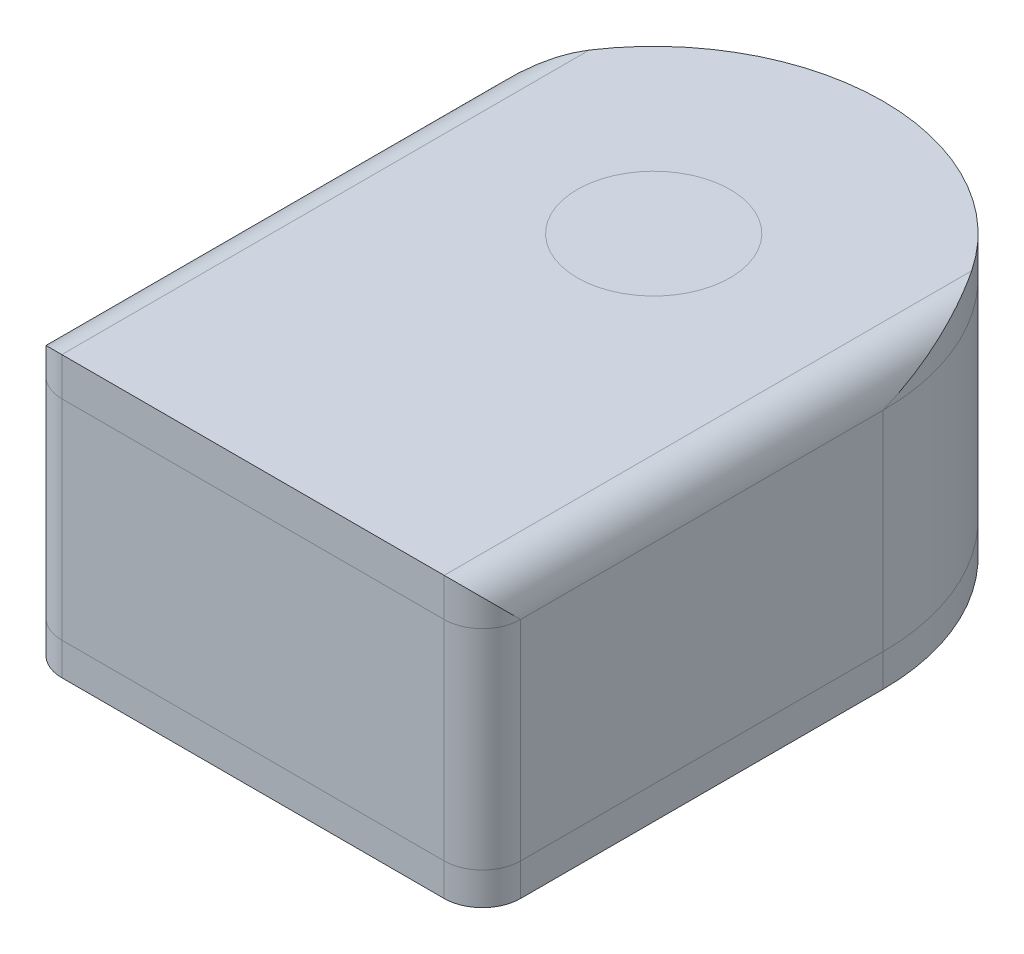
ISO-10303-21;
HEADER;
FILE_DESCRIPTION(('STEP AP214'),'2;1');
FILE_NAME('part.step','',(''),(''),'','','');
FILE_SCHEMA(('AUTOMOTIVE_DESIGN { 1 0 10303 214 1 1 1 1 }'));
ENDSEC;
DATA;
#1=APPLICATION_CONTEXT('core data for automotive mechanical design processes');
#2=APPLICATION_PROTOCOL_DEFINITION('international standard','automotive_design',2000,#1);
#3=PRODUCT_CONTEXT('',#1,'mechanical');
#4=PRODUCT('Part','Part','',(#3));
#5=PRODUCT_RELATED_PRODUCT_CATEGORY('part','',(#4));
#6=PRODUCT_DEFINITION_FORMATION('','',#4);
#7=PRODUCT_DEFINITION_CONTEXT('part definition',#1,'design');
#8=PRODUCT_DEFINITION('design','',#6,#7);
#9=PRODUCT_DEFINITION_SHAPE('','',#8);
#10=(LENGTH_UNIT() NAMED_UNIT(*) SI_UNIT(.MILLI.,.METRE.));
#11=(NAMED_UNIT(*) PLANE_ANGLE_UNIT() SI_UNIT($,.RADIAN.));
#12=(NAMED_UNIT(*) SI_UNIT($,.STERADIAN.) SOLID_ANGLE_UNIT());
#13=UNCERTAINTY_MEASURE_WITH_UNIT(LENGTH_MEASURE(1.E-05),#10,'distance_accuracy_value','');
#14=(GEOMETRIC_REPRESENTATION_CONTEXT(3) GLOBAL_UNCERTAINTY_ASSIGNED_CONTEXT((#13)) GLOBAL_UNIT_ASSIGNED_CONTEXT((#10,
#11,#12)) REPRESENTATION_CONTEXT('',''));
#15=CARTESIAN_POINT('',(0.,0.,0.));
#16=DIRECTION('',(0.,0.,1.));
#17=DIRECTION('',(1.,0.,0.));
#18=AXIS2_PLACEMENT_3D('',#15,#16,#17);
#19=CARTESIAN_POINT('',(-12.5,9.15,13.1));
#20=DIRECTION('',(0.,0.,-1.));
#21=DIRECTION('',(-1.,0.,0.));
#22=AXIS2_PLACEMENT_3D('',#19,#20,#21);
#23=PLANE('',#22);
#24=DIRECTION('',(0.,-1.,0.));
#25=VECTOR('',#24,1.);
#26=CARTESIAN_POINT('',(12.5,9.15,13.1));
#27=LINE('',#26,#25);
#28=CARTESIAN_POINT('',(12.5,6.65,13.1));
#29=VERTEX_POINT('',#28);
#30=CARTESIAN_POINT('',(12.5,-7.02,13.1));
#31=VERTEX_POINT('',#30);
#32=EDGE_CURVE('E187',#29,#31,#27,.T.);
#33=ORIENTED_EDGE('',*,*,#32,.F.);
#34=DIRECTION('',(-1.,0.,0.));
#35=VECTOR('',#34,1.);
#36=CARTESIAN_POINT('',(-12.5,6.65,13.1));
#37=LINE('',#36,#35);
#38=CARTESIAN_POINT('',(-12.5,6.65,13.1));
#39=VERTEX_POINT('',#38);
#40=EDGE_CURVE('E12',#29,#39,#37,.T.);
#41=ORIENTED_EDGE('',*,*,#40,.T.);
#42=DIRECTION('',(0.,-1.,0.));
#43=VECTOR('',#42,1.);
#44=CARTESIAN_POINT('',(-12.5,9.15,13.1));
#45=LINE('',#44,#43);
#46=CARTESIAN_POINT('',(-12.5,-7.02,13.1));
#47=VERTEX_POINT('',#46);
#48=EDGE_CURVE('E148',#39,#47,#45,.T.);
#49=ORIENTED_EDGE('',*,*,#48,.T.);
#50=DIRECTION('',(-1.,0.,0.));
#51=VECTOR('',#50,1.);
#52=CARTESIAN_POINT('',(-12.5,-7.02,13.1));
#53=LINE('',#52,#51);
#54=EDGE_CURVE('E278',#31,#47,#53,.T.);
#55=ORIENTED_EDGE('',*,*,#54,.F.);
#56=EDGE_LOOP('',(#33,#41,#49,#55));
#57=FACE_BOUND('',#56,.T.);
#58=ADVANCED_FACE('F38',(#57),#23,.F.);
#59=CARTESIAN_POINT('',(-12.5,9.15,10.6));
#60=DIRECTION('',(0.,-1.,0.));
#61=DIRECTION('',(0.,0.,-1.));
#62=AXIS2_PLACEMENT_3D('',#59,#60,#61);
#63=CYLINDRICAL_SURFACE('',#62,2.5);
#64=ORIENTED_EDGE('',*,*,#48,.F.);
#65=CARTESIAN_POINT('',(-12.5,6.65,10.6));
#66=DIRECTION('',(0.,-1.,0.));
#67=DIRECTION('',(0.,0.,-1.));
#68=AXIS2_PLACEMENT_3D('',#65,#66,#67);
#69=CIRCLE('',#68,2.5);
#70=CARTESIAN_POINT('',(-15.,6.65,10.6));
#71=VERTEX_POINT('',#70);
#72=EDGE_CURVE('E47',#39,#71,#69,.T.);
#73=ORIENTED_EDGE('',*,*,#72,.T.);
#74=DIRECTION('',(0.,-1.,0.));
#75=VECTOR('',#74,1.);
#76=CARTESIAN_POINT('',(-15.,9.15,10.6));
#77=LINE('',#76,#75);
#78=CARTESIAN_POINT('',(-15.,-7.02,10.6));
#79=VERTEX_POINT('',#78);
#80=EDGE_CURVE('E189',#71,#79,#77,.T.);
#81=ORIENTED_EDGE('',*,*,#80,.T.);
#82=CARTESIAN_POINT('',(-12.5,-7.02,10.6));
#83=DIRECTION('',(0.,-1.,0.));
#84=DIRECTION('',(0.,0.,-1.));
#85=AXIS2_PLACEMENT_3D('',#82,#83,#84);
#86=CIRCLE('',#85,2.5);
#87=EDGE_CURVE('E272',#47,#79,#86,.T.);
#88=ORIENTED_EDGE('',*,*,#87,.F.);
#89=EDGE_LOOP('',(#64,#73,#81,#88));
#90=FACE_BOUND('',#89,.T.);
#91=ADVANCED_FACE('F234',(#90),#63,.T.);
#92=CARTESIAN_POINT('',(12.5,9.15,10.6));
#93=DIRECTION('',(0.,-1.,0.));
#94=DIRECTION('',(0.,0.,-1.));
#95=AXIS2_PLACEMENT_3D('',#92,#93,#94);
#96=CYLINDRICAL_SURFACE('',#95,2.5);
#97=DIRECTION('',(0.,-1.,0.));
#98=VECTOR('',#97,1.);
#99=CARTESIAN_POINT('',(15.,9.15,10.6));
#100=LINE('',#99,#98);
#101=CARTESIAN_POINT('',(15.,6.65,10.6));
#102=VERTEX_POINT('',#101);
#103=CARTESIAN_POINT('',(15.,-7.02,10.6));
#104=VERTEX_POINT('',#103);
#105=EDGE_CURVE('E183',#102,#104,#100,.T.);
#106=ORIENTED_EDGE('',*,*,#105,.F.);
#107=CARTESIAN_POINT('',(12.5,6.65,10.6));
#108=DIRECTION('',(0.,-1.,0.));
#109=DIRECTION('',(0.,0.,-1.));
#110=AXIS2_PLACEMENT_3D('',#107,#108,#109);
#111=CIRCLE('',#110,2.5);
#112=EDGE_CURVE('E302',#102,#29,#111,.T.);
#113=ORIENTED_EDGE('',*,*,#112,.T.);
#114=ORIENTED_EDGE('',*,*,#32,.T.);
#115=CARTESIAN_POINT('',(12.5,-7.02,10.6));
#116=DIRECTION('',(0.,-1.,0.));
#117=DIRECTION('',(0.,0.,-1.));
#118=AXIS2_PLACEMENT_3D('',#115,#116,#117);
#119=CIRCLE('',#118,2.5);
#120=EDGE_CURVE('E282',#104,#31,#119,.T.);
#121=ORIENTED_EDGE('',*,*,#120,.F.);
#122=EDGE_LOOP('',(#106,#113,#114,#121));
#123=FACE_BOUND('',#122,.T.);
#124=ADVANCED_FACE('F241',(#123),#96,.T.);
#125=CARTESIAN_POINT('',(0.,9.15,-13.1));
#126=DIRECTION('',(0.,-1.,0.));
#127=DIRECTION('',(0.,0.,-1.));
#128=AXIS2_PLACEMENT_3D('',#125,#126,#127);
#129=CYLINDRICAL_SURFACE('',#128,15.);
#130=DIRECTION('',(0.,-1.,0.));
#131=VECTOR('',#130,1.);
#132=CARTESIAN_POINT('',(-15.,9.15,-13.1));
#133=LINE('',#132,#131);
#134=CARTESIAN_POINT('',(-15.,6.65,-13.1));
#135=VERTEX_POINT('',#134);
#136=CARTESIAN_POINT('',(-15.,-7.02,-13.1));
#137=VERTEX_POINT('',#136);
#138=EDGE_CURVE('E193',#135,#137,#133,.T.);
#139=ORIENTED_EDGE('',*,*,#138,.F.);
#140=CARTESIAN_POINT('',(0.,6.65,-13.1));
#141=DIRECTION('',(0.,-1.,0.));
#142=DIRECTION('',(0.,0.,-1.));
#143=AXIS2_PLACEMENT_3D('',#140,#141,#142);
#144=CIRCLE('',#143,15.);
#145=CARTESIAN_POINT('',(15.,6.65,-13.1));
#146=VERTEX_POINT('',#145);
#147=EDGE_CURVE('E300',#135,#146,#144,.T.);
#148=ORIENTED_EDGE('',*,*,#147,.T.);
#149=DIRECTION('',(0.,-1.,0.));
#150=VECTOR('',#149,1.);
#151=CARTESIAN_POINT('',(15.,9.15,-13.1));
#152=LINE('',#151,#150);
#153=CARTESIAN_POINT('',(15.,-7.02,-13.1));
#154=VERTEX_POINT('',#153);
#155=EDGE_CURVE('E157',#146,#154,#152,.T.);
#156=ORIENTED_EDGE('',*,*,#155,.T.);
#157=CARTESIAN_POINT('',(0.,-7.02,-13.1));
#158=DIRECTION('',(0.,-1.,0.));
#159=DIRECTION('',(0.,0.,-1.));
#160=AXIS2_PLACEMENT_3D('',#157,#158,#159);
#161=CIRCLE('',#160,15.);
#162=EDGE_CURVE('E289',#137,#154,#161,.T.);
#163=ORIENTED_EDGE('',*,*,#162,.F.);
#164=EDGE_LOOP('',(#139,#148,#156,#163));
#165=FACE_BOUND('',#164,.T.);
#166=ADVANCED_FACE('F217',(#165),#129,.T.);
#167=CARTESIAN_POINT('',(0.,-9.15,-13.1));
#168=DIRECTION('',(0.,1.,0.));
#169=DIRECTION('',(0.,0.,1.));
#170=AXIS2_PLACEMENT_3D('',#167,#168,#169);
#171=PLANE('',#170);
#172=CARTESIAN_POINT('',(9.525,-9.15,-13.1000000000001));
#173=DIRECTION('',(0.,-1.,0.));
#174=DIRECTION('',(0.,0.,-1.));
#175=AXIS2_PLACEMENT_3D('',#172,#173,#174);
#176=CIRCLE('',#175,1.25);
#177=CARTESIAN_POINT('',(9.525,-9.15,-14.3500000000001));
#178=VERTEX_POINT('',#177);
#179=EDGE_CURVE('E409',#178,#178,#176,.T.);
#180=ORIENTED_EDGE('',*,*,#179,.F.);
#181=EDGE_LOOP('',(#180));
#182=FACE_BOUND('',#181,.T.);
#183=CARTESIAN_POINT('',(-9.52500000000001,-9.15,-13.1));
#184=DIRECTION('',(0.,-1.,0.));
#185=DIRECTION('',(0.,0.,-1.));
#186=AXIS2_PLACEMENT_3D('',#183,#184,#185);
#187=CIRCLE('',#186,1.25);
#188=CARTESIAN_POINT('',(-9.52500000000001,-9.15,-14.35));
#189=VERTEX_POINT('',#188);
#190=EDGE_CURVE('E413',#189,#189,#187,.T.);
#191=ORIENTED_EDGE('',*,*,#190,.F.);
#192=EDGE_LOOP('',(#191));
#193=FACE_BOUND('',#192,.T.);
#194=CARTESIAN_POINT('',(9.04996546954743,-9.15,-7.8750000000001));
#195=DIRECTION('',(0.,-1.,0.));
#196=DIRECTION('',(0.,0.,-1.));
#197=AXIS2_PLACEMENT_3D('',#194,#195,#196);
#198=CIRCLE('',#197,0.799999999999999);
#199=CARTESIAN_POINT('',(9.04996546954743,-9.15,-8.6750000000001));
#200=VERTEX_POINT('',#199);
#201=EDGE_CURVE('E419',#200,#200,#198,.T.);
#202=ORIENTED_EDGE('',*,*,#201,.F.);
#203=EDGE_LOOP('',(#202));
#204=FACE_BOUND('',#203,.T.);
#205=CARTESIAN_POINT('',(-9.04996546954737,-9.15,-7.87499999999997));
#206=DIRECTION('',(0.,-1.,0.));
#207=DIRECTION('',(0.,0.,-1.));
#208=AXIS2_PLACEMENT_3D('',#205,#206,#207);
#209=CIRCLE('',#208,0.800000000000002);
#210=CARTESIAN_POINT('',(-9.04996546954737,-9.15,-8.67499999999997));
#211=VERTEX_POINT('',#210);
#212=EDGE_CURVE('E425',#211,#211,#209,.T.);
#213=ORIENTED_EDGE('',*,*,#212,.F.);
#214=EDGE_LOOP('',(#213));
#215=FACE_BOUND('',#214,.T.);
#216=CARTESIAN_POINT('',(0.,-9.15,-23.55));
#217=DIRECTION('',(0.,-1.,0.));
#218=DIRECTION('',(0.,0.,-1.));
#219=AXIS2_PLACEMENT_3D('',#216,#217,#218);
#220=CIRCLE('',#219,0.8);
#221=CARTESIAN_POINT('',(0.,-9.15,-24.35));
#222=VERTEX_POINT('',#221);
#223=EDGE_CURVE('E431',#222,#222,#220,.T.);
#224=ORIENTED_EDGE('',*,*,#223,.F.);
#225=EDGE_LOOP('',(#224));
#226=FACE_BOUND('',#225,.T.);
#227=CARTESIAN_POINT('',(0.,-9.15,-13.1));
#228=DIRECTION('',(0.,1.,0.));
#229=DIRECTION('',(0.,0.,1.));
#230=AXIS2_PLACEMENT_3D('',#227,#228,#229);
#231=CIRCLE('',#230,15.);
#232=CARTESIAN_POINT('',(15.,-9.15,-13.1));
#233=VERTEX_POINT('',#232);
#234=CARTESIAN_POINT('',(-15.,-9.15,-13.1));
#235=VERTEX_POINT('',#234);
#236=EDGE_CURVE('E163',#233,#235,#231,.T.);
#237=ORIENTED_EDGE('',*,*,#236,.F.);
#238=DIRECTION('',(0.,0.,-1.));
#239=VECTOR('',#238,1.);
#240=CARTESIAN_POINT('',(15.,-9.15,-13.1));
#241=LINE('',#240,#239);
#242=CARTESIAN_POINT('',(15.,-9.15,10.6));
#243=VERTEX_POINT('',#242);
#244=EDGE_CURVE('E159',#243,#233,#241,.T.);
#245=ORIENTED_EDGE('',*,*,#244,.F.);
#246=CARTESIAN_POINT('',(12.5,-9.15,10.6));
#247=DIRECTION('',(0.,1.,0.));
#248=DIRECTION('',(0.,0.,1.));
#249=AXIS2_PLACEMENT_3D('',#246,#247,#248);
#250=CIRCLE('',#249,2.5);
#251=CARTESIAN_POINT('',(12.5,-9.15,13.1));
#252=VERTEX_POINT('',#251);
#253=EDGE_CURVE('E176',#252,#243,#250,.T.);
#254=ORIENTED_EDGE('',*,*,#253,.F.);
#255=DIRECTION('',(1.,0.,0.));
#256=VECTOR('',#255,1.);
#257=CARTESIAN_POINT('',(-12.5,-9.15,13.1));
#258=LINE('',#257,#256);
#259=CARTESIAN_POINT('',(-12.5,-9.15,13.1));
#260=VERTEX_POINT('',#259);
#261=EDGE_CURVE('E173',#260,#252,#258,.T.);
#262=ORIENTED_EDGE('',*,*,#261,.F.);
#263=CARTESIAN_POINT('',(-12.5,-9.15,10.6));
#264=DIRECTION('',(0.,1.,0.));
#265=DIRECTION('',(0.,0.,1.));
#266=AXIS2_PLACEMENT_3D('',#263,#264,#265);
#267=CIRCLE('',#266,2.5);
#268=CARTESIAN_POINT('',(-15.,-9.15,10.6));
#269=VERTEX_POINT('',#268);
#270=EDGE_CURVE('E170',#269,#260,#267,.T.);
#271=ORIENTED_EDGE('',*,*,#270,.F.);
#272=DIRECTION('',(0.,0.,1.));
#273=VECTOR('',#272,1.);
#274=CARTESIAN_POINT('',(-15.,-9.15,-13.1));
#275=LINE('',#274,#273);
#276=EDGE_CURVE('E166',#235,#269,#275,.T.);
#277=ORIENTED_EDGE('',*,*,#276,.F.);
#278=EDGE_LOOP('',(#237,#245,#254,#262,#271,#277));
#279=FACE_BOUND('',#278,.T.);
#280=CARTESIAN_POINT('',(0.,-9.15,-13.1));
#281=DIRECTION('',(0.,-1.,0.));
#282=DIRECTION('',(0.,0.,-1.));
#283=AXIS2_PLACEMENT_3D('',#280,#281,#282);
#284=CIRCLE('',#283,5.);
#285=CARTESIAN_POINT('',(0.,-9.15,-18.1));
#286=VERTEX_POINT('',#285);
#287=EDGE_CURVE('E403',#286,#286,#284,.T.);
#288=ORIENTED_EDGE('',*,*,#287,.F.);
#289=EDGE_LOOP('',(#288));
#290=FACE_BOUND('',#289,.T.);
#291=ADVANCED_FACE('F324',(#182,#193,#204,#215,#226,#279,#290),#171,.F.);
#292=CARTESIAN_POINT('',(0.,9.15,-13.1));
#293=DIRECTION('',(0.,1.,0.));
#294=DIRECTION('',(0.,0.,1.));
#295=AXIS2_PLACEMENT_3D('',#292,#293,#294);
#296=PLANE('',#295);
#297=CARTESIAN_POINT('',(0.,9.15,-13.1));
#298=DIRECTION('',(0.,1.,0.));
#299=DIRECTION('',(0.,0.,1.));
#300=AXIS2_PLACEMENT_3D('',#297,#298,#299);
#301=CIRCLE('',#300,15.);
#302=CARTESIAN_POINT('',(12.5,9.15,-21.3915619758885));
#303=VERTEX_POINT('',#302);
#304=CARTESIAN_POINT('',(-12.5,9.15,-21.3915619758885));
#305=VERTEX_POINT('',#304);
#306=EDGE_CURVE('E141',#303,#305,#301,.T.);
#307=ORIENTED_EDGE('',*,*,#306,.T.);
#308=DIRECTION('',(0.,0.,1.));
#309=VECTOR('',#308,1.);
#310=CARTESIAN_POINT('',(-12.5,9.15,10.6));
#311=LINE('',#310,#309);
#312=CARTESIAN_POINT('',(-12.5,9.15,13.1));
#313=VERTEX_POINT('',#312);
#314=EDGE_CURVE('E125',#305,#313,#311,.T.);
#315=ORIENTED_EDGE('',*,*,#314,.T.);
#316=DIRECTION('',(1.,0.,0.));
#317=VECTOR('',#316,1.);
#318=CARTESIAN_POINT('',(-12.5,9.15,13.1));
#319=LINE('',#318,#317);
#320=CARTESIAN_POINT('',(12.5,9.15,13.1));
#321=VERTEX_POINT('',#320);
#322=EDGE_CURVE('E139',#313,#321,#319,.T.);
#323=ORIENTED_EDGE('',*,*,#322,.T.);
#324=DIRECTION('',(0.,0.,-1.));
#325=VECTOR('',#324,1.);
#326=CARTESIAN_POINT('',(12.5,9.15,-13.1));
#327=LINE('',#326,#325);
#328=EDGE_CURVE('E142',#321,#303,#327,.T.);
#329=ORIENTED_EDGE('',*,*,#328,.T.);
#330=EDGE_LOOP('',(#307,#315,#323,#329));
#331=FACE_BOUND('',#330,.T.);
#332=CARTESIAN_POINT('',(0.,9.15,-13.1));
#333=DIRECTION('',(0.,1.,0.));
#334=DIRECTION('',(0.,0.,1.));
#335=AXIS2_PLACEMENT_3D('',#332,#333,#334);
#336=CIRCLE('',#335,5.);
#337=CARTESIAN_POINT('',(0.,9.15,-8.10000000000001));
#338=VERTEX_POINT('',#337);
#339=EDGE_CURVE('E281',#338,#338,#336,.F.);
#340=ORIENTED_EDGE('',*,*,#339,.T.);
#341=EDGE_LOOP('',(#340));
#342=FACE_BOUND('',#341,.T.);
#343=ADVANCED_FACE('F135',(#331,#342),#296,.T.);
#344=EDGE_CURVE('E186',#31,#252,#27,.T.);
#345=ORIENTED_EDGE('',*,*,#344,.F.);
#346=ORIENTED_EDGE('',*,*,#54,.T.);
#347=EDGE_CURVE('E150',#47,#260,#45,.T.);
#348=ORIENTED_EDGE('',*,*,#347,.T.);
#349=ORIENTED_EDGE('',*,*,#261,.T.);
#350=EDGE_LOOP('',(#345,#346,#348,#349));
#351=FACE_BOUND('',#350,.T.);
#352=ADVANCED_FACE('F236',(#351),#23,.F.);
#353=EDGE_CURVE('E182',#104,#243,#100,.T.);
#354=ORIENTED_EDGE('',*,*,#353,.F.);
#355=ORIENTED_EDGE('',*,*,#120,.T.);
#356=ORIENTED_EDGE('',*,*,#344,.T.);
#357=ORIENTED_EDGE('',*,*,#253,.T.);
#358=EDGE_LOOP('',(#354,#355,#356,#357));
#359=FACE_BOUND('',#358,.T.);
#360=ADVANCED_FACE('F246',(#359),#96,.T.);
#361=CARTESIAN_POINT('',(15.,9.15,-13.1));
#362=DIRECTION('',(-1.,0.,0.));
#363=DIRECTION('',(0.,0.,1.));
#364=AXIS2_PLACEMENT_3D('',#361,#362,#363);
#365=PLANE('',#364);
#366=EDGE_CURVE('E155',#154,#233,#152,.T.);
#367=ORIENTED_EDGE('',*,*,#366,.F.);
#368=DIRECTION('',(0.,0.,1.));
#369=VECTOR('',#368,1.);
#370=CARTESIAN_POINT('',(15.,-7.02,-13.1));
#371=LINE('',#370,#369);
#372=EDGE_CURVE('E284',#154,#104,#371,.T.);
#373=ORIENTED_EDGE('',*,*,#372,.T.);
#374=ORIENTED_EDGE('',*,*,#353,.T.);
#375=ORIENTED_EDGE('',*,*,#244,.T.);
#376=EDGE_LOOP('',(#367,#373,#374,#375));
#377=FACE_BOUND('',#376,.T.);
#378=ADVANCED_FACE('F261',(#377),#365,.F.);
#379=ORIENTED_EDGE('',*,*,#347,.F.);
#380=ORIENTED_EDGE('',*,*,#87,.T.);
#381=EDGE_CURVE('E147',#79,#269,#77,.T.);
#382=ORIENTED_EDGE('',*,*,#381,.T.);
#383=ORIENTED_EDGE('',*,*,#270,.T.);
#384=EDGE_LOOP('',(#379,#380,#382,#383));
#385=FACE_BOUND('',#384,.T.);
#386=ADVANCED_FACE('F243',(#385),#63,.T.);
#387=CARTESIAN_POINT('',(-15.,9.15,-13.1));
#388=DIRECTION('',(1.,0.,0.));
#389=DIRECTION('',(0.,0.,-1.));
#390=AXIS2_PLACEMENT_3D('',#387,#388,#389);
#391=PLANE('',#390);
#392=ORIENTED_EDGE('',*,*,#381,.F.);
#393=DIRECTION('',(0.,0.,-1.));
#394=VECTOR('',#393,1.);
#395=CARTESIAN_POINT('',(-15.,-7.02,-13.1));
#396=LINE('',#395,#394);
#397=EDGE_CURVE('E285',#79,#137,#396,.T.);
#398=ORIENTED_EDGE('',*,*,#397,.T.);
#399=EDGE_CURVE('E192',#137,#235,#133,.T.);
#400=ORIENTED_EDGE('',*,*,#399,.T.);
#401=ORIENTED_EDGE('',*,*,#276,.T.);
#402=EDGE_LOOP('',(#392,#398,#400,#401));
#403=FACE_BOUND('',#402,.T.);
#404=ADVANCED_FACE('F259',(#403),#391,.F.);
#405=ORIENTED_EDGE('',*,*,#399,.F.);
#406=ORIENTED_EDGE('',*,*,#162,.T.);
#407=ORIENTED_EDGE('',*,*,#366,.T.);
#408=ORIENTED_EDGE('',*,*,#236,.T.);
#409=EDGE_LOOP('',(#405,#406,#407,#408));
#410=FACE_BOUND('',#409,.T.);
#411=ADVANCED_FACE('F215',(#410),#129,.T.);
#412=ORIENTED_EDGE('',*,*,#147,.F.);
#413=CARTESIAN_POINT('',(-12.5,9.15,-21.3915619758885));
#414=CARTESIAN_POINT('',(-12.558644619672,9.14999394035478,-21.3031540842486));
#415=CARTESIAN_POINT('',(-12.6163370426528,9.14793726703578,-21.21414090634));
#416=CARTESIAN_POINT('',(-12.7297356599779,9.14007172271425,-21.0350521748542));
#417=CARTESIAN_POINT('',(-12.7854423711031,9.13426383559881,-20.9449769059275));
#418=CARTESIAN_POINT('',(-12.9493238552861,9.11175996934914,-20.6736127636441));
#419=CARTESIAN_POINT('',(-13.0544563705301,9.08998141805196,-20.4908893061959));
#420=CARTESIAN_POINT('',(-13.2557117360854,9.03531233899531,-20.1235151276506));
#421=CARTESIAN_POINT('',(-13.3518792075753,9.00248106245023,-19.9388796673043));
#422=CARTESIAN_POINT('',(-13.535803662654,8.92749230592283,-19.5672283248167));
#423=CARTESIAN_POINT('',(-13.6235557862302,8.88532948274538,-19.3802111369663));
#424=CARTESIAN_POINT('',(-13.8580284302033,8.7560644825245,-18.8526619958611));
#425=CARTESIAN_POINT('',(-13.9952046903671,8.66015006766178,-18.5100083712003));
#426=CARTESIAN_POINT('',(-14.2425508546149,8.44996003870077,-17.8205968392715));
#427=CARTESIAN_POINT('',(-14.3527058983571,8.33567437824968,-17.4738367830571));
#428=CARTESIAN_POINT('',(-14.5470003067079,8.09358938900195,-16.7764416320562));
#429=CARTESIAN_POINT('',(-14.6310527357808,7.96574676492091,-16.4257975327351));
#430=CARTESIAN_POINT('',(-14.773258817173,7.70111608571957,-15.7228545930813));
#431=CARTESIAN_POINT('',(-14.8314232910257,7.56433179581741,-15.3705565064904));
#432=CARTESIAN_POINT('',(-14.9175797916417,7.30002445050636,-14.7021979593767));
#433=CARTESIAN_POINT('',(-14.9481102566665,7.173049662639,-14.3862412034705));
#434=CARTESIAN_POINT('',(-14.9890563766523,6.91713113630137,-13.7543912501446));
#435=CARTESIAN_POINT('',(-14.9995054499665,6.78819102955062,-13.4384988233877));
#436=CARTESIAN_POINT('',(-14.9999942841066,6.65617211727328,-13.1151185396749));
#437=CARTESIAN_POINT('',(-14.9999999982368,6.65308604904885,-13.1075592472904));
#438=CARTESIAN_POINT('',(-15.,6.65,-13.1));
#439=B_SPLINE_CURVE_WITH_KNOTS('',3,(#413,#414,#415,#416,#417,#418,#419,#420,#421,#422,#423,
#424,#425,#426,#427,#428,#429,#430,#431,#432,#433,#434,#435,#436,#437,#438),.UNSPECIFIED.,.F.,
.F.,(4,2,2,2,2,2,2,2,2,2,2,2,4),(0.,0.318208918514055,0.636334409477569,1.27152211732257,
1.90335755582731,2.5355557203533,3.67780985626468,4.82069077454425,5.96733825117686,
7.11350596165543,8.13858447771232,9.16195563201056,9.18645053543715),.UNSPECIFIED.);
#440=EDGE_CURVE('E205',#135,#305,#439,.F.);
#441=ORIENTED_EDGE('',*,*,#440,.T.);
#442=ORIENTED_EDGE('',*,*,#306,.F.);
#443=CARTESIAN_POINT('',(12.5,9.15,-21.3915619758885));
#444=CARTESIAN_POINT('',(12.558644619672,9.14999394035479,-21.3031540842486));
#445=CARTESIAN_POINT('',(12.6163370426528,9.14793726703578,-21.21414090634));
#446=CARTESIAN_POINT('',(12.7297356599778,9.14007172271425,-21.0350521748542));
#447=CARTESIAN_POINT('',(12.785442371103,9.13426383559881,-20.9449769059275));
#448=CARTESIAN_POINT('',(12.949323855286,9.11175996934914,-20.6736127636441));
#449=CARTESIAN_POINT('',(13.0544563705301,9.08998141805197,-20.490889306196));
#450=CARTESIAN_POINT('',(13.2557117360854,9.03531233899531,-20.1235151276507));
#451=CARTESIAN_POINT('',(13.3518792075753,9.00248106245023,-19.9388796673043));
#452=CARTESIAN_POINT('',(13.535803662654,8.92749230592283,-19.5672283248168));
#453=CARTESIAN_POINT('',(13.6235557862302,8.88532948274538,-19.3802111369663));
#454=CARTESIAN_POINT('',(13.8580284302033,8.7560644825245,-18.8526619958611));
#455=CARTESIAN_POINT('',(13.9952046903671,8.66015006766178,-18.5100083712003));
#456=CARTESIAN_POINT('',(14.2425508546149,8.44996003870076,-17.8205968392715));
#457=CARTESIAN_POINT('',(14.3527058983571,8.33567437824966,-17.4738367830571));
#458=CARTESIAN_POINT('',(14.5470003067078,8.09358938900194,-16.7764416320562));
#459=CARTESIAN_POINT('',(14.6310527357808,7.96574676492092,-16.4257975327351));
#460=CARTESIAN_POINT('',(14.773258817173,7.70111608571954,-15.7228545930813));
#461=CARTESIAN_POINT('',(14.8314232910257,7.56433179581734,-15.3705565064905));
#462=CARTESIAN_POINT('',(14.9175797916417,7.30002445050641,-14.7021979593767));
#463=CARTESIAN_POINT('',(14.9481102566665,7.17304966263918,-14.3862412034705));
#464=CARTESIAN_POINT('',(14.9890563766523,6.91713113630119,-13.7543912501447));
#465=CARTESIAN_POINT('',(14.9995054499665,6.78819102954993,-13.438498823388));
#466=CARTESIAN_POINT('',(14.9999942841066,6.65617211727324,-13.1151185396749));
#467=CARTESIAN_POINT('',(14.9999999982368,6.65308604904884,-13.1075592472904));
#468=CARTESIAN_POINT('',(15.,6.65,-13.1));
#469=B_SPLINE_CURVE_WITH_KNOTS('',3,(#443,#444,#445,#446,#447,#448,#449,#450,#451,#452,#453,
#454,#455,#456,#457,#458,#459,#460,#461,#462,#463,#464,#465,#466,#467,#468),.UNSPECIFIED.,.F.,
.F.,(4,2,2,2,2,2,2,2,2,2,2,2,4),(0.,0.318208918514044,0.636334409477545,1.27152211732252,
1.9033575558273,2.5355557203533,3.6778098562647,4.82069077454428,5.96733825117688,
7.11350596165543,8.13858447771232,9.16195563201056,9.18645053543715),.UNSPECIFIED.);
#470=EDGE_CURVE('E198',#303,#146,#469,.T.);
#471=ORIENTED_EDGE('',*,*,#470,.T.);
#472=EDGE_LOOP('',(#412,#441,#442,#471));
#473=FACE_BOUND('',#472,.T.);
#474=ADVANCED_FACE('F210',(#473),#129,.T.);
#475=ORIENTED_EDGE('',*,*,#397,.F.);
#476=ORIENTED_EDGE('',*,*,#80,.F.);
#477=DIRECTION('',(0.,0.,1.));
#478=VECTOR('',#477,1.);
#479=CARTESIAN_POINT('',(-15.,6.65,-13.1));
#480=LINE('',#479,#478);
#481=EDGE_CURVE('E127',#71,#135,#480,.F.);
#482=ORIENTED_EDGE('',*,*,#481,.T.);
#483=ORIENTED_EDGE('',*,*,#138,.T.);
#484=EDGE_LOOP('',(#475,#476,#482,#483));
#485=FACE_BOUND('',#484,.T.);
#486=ADVANCED_FACE('F214',(#485),#391,.F.);
#487=ORIENTED_EDGE('',*,*,#72,.F.);
#488=EDGE_CURVE('E144',#313,#39,#45,.T.);
#489=ORIENTED_EDGE('',*,*,#488,.F.);
#490=CARTESIAN_POINT('',(-12.5,6.65,10.6));
#491=DIRECTION('',(0.,0.707106781186547,-0.707106781186547));
#492=DIRECTION('',(0.,-0.707106781186547,-0.707106781186547));
#493=AXIS2_PLACEMENT_3D('',#490,#491,#492);
#494=ELLIPSE('',#493,3.53553390593274,2.5);
#495=EDGE_CURVE('E121',#313,#71,#494,.F.);
#496=ORIENTED_EDGE('',*,*,#495,.T.);
#497=EDGE_LOOP('',(#487,#489,#496));
#498=FACE_BOUND('',#497,.T.);
#499=ADVANCED_FACE('F145',(#498),#63,.T.);
#500=ORIENTED_EDGE('',*,*,#40,.F.);
#501=EDGE_CURVE('E153',#321,#29,#27,.T.);
#502=ORIENTED_EDGE('',*,*,#501,.F.);
#503=ORIENTED_EDGE('',*,*,#322,.F.);
#504=ORIENTED_EDGE('',*,*,#488,.T.);
#505=EDGE_LOOP('',(#500,#502,#503,#504));
#506=FACE_BOUND('',#505,.T.);
#507=ADVANCED_FACE('F151',(#506),#23,.F.);
#508=ORIENTED_EDGE('',*,*,#112,.F.);
#509=CARTESIAN_POINT('',(12.5,6.65,10.6));
#510=DIRECTION('',(0.,-0.707106781186547,0.707106781186547));
#511=DIRECTION('',(0.,0.707106781186547,0.707106781186547));
#512=AXIS2_PLACEMENT_3D('',#509,#510,#511);
#513=ELLIPSE('',#512,3.53553390593274,2.5);
#514=EDGE_CURVE('E307',#102,#321,#513,.T.);
#515=ORIENTED_EDGE('',*,*,#514,.T.);
#516=ORIENTED_EDGE('',*,*,#501,.T.);
#517=EDGE_LOOP('',(#508,#515,#516));
#518=FACE_BOUND('',#517,.T.);
#519=ADVANCED_FACE('F249',(#518),#96,.T.);
#520=ORIENTED_EDGE('',*,*,#372,.F.);
#521=ORIENTED_EDGE('',*,*,#155,.F.);
#522=DIRECTION('',(0.,0.,-1.));
#523=VECTOR('',#522,1.);
#524=CARTESIAN_POINT('',(15.,6.65,10.6));
#525=LINE('',#524,#523);
#526=EDGE_CURVE('E309',#146,#102,#525,.F.);
#527=ORIENTED_EDGE('',*,*,#526,.T.);
#528=ORIENTED_EDGE('',*,*,#105,.T.);
#529=EDGE_LOOP('',(#520,#521,#527,#528));
#530=FACE_BOUND('',#529,.T.);
#531=ADVANCED_FACE('F230',(#530),#365,.F.);
#532=ORIENTED_EDGE('',*,*,#339,.F.);
#533=EDGE_LOOP('',(#532));
#534=FACE_BOUND('',#533,.T.);
#535=ADVANCED_FACE('F222',(#534),#296,.T.);
#536=CARTESIAN_POINT('',(-12.5,6.65,-13.1));
#537=DIRECTION('',(0.,0.,-1.));
#538=DIRECTION('',(-1.,0.,0.));
#539=AXIS2_PLACEMENT_3D('',#536,#537,#538);
#540=CYLINDRICAL_SURFACE('',#539,2.5);
#541=ORIENTED_EDGE('',*,*,#440,.F.);
#542=ORIENTED_EDGE('',*,*,#481,.F.);
#543=ORIENTED_EDGE('',*,*,#495,.F.);
#544=ORIENTED_EDGE('',*,*,#314,.F.);
#545=EDGE_LOOP('',(#541,#542,#543,#544));
#546=FACE_BOUND('',#545,.T.);
#547=ADVANCED_FACE('F124',(#546),#540,.T.);
#548=CARTESIAN_POINT('',(12.5,6.65,-13.1));
#549=DIRECTION('',(0.,0.,1.));
#550=DIRECTION('',(1.,0.,0.));
#551=AXIS2_PLACEMENT_3D('',#548,#549,#550);
#552=CYLINDRICAL_SURFACE('',#551,2.5);
#553=ORIENTED_EDGE('',*,*,#514,.F.);
#554=ORIENTED_EDGE('',*,*,#526,.F.);
#555=ORIENTED_EDGE('',*,*,#470,.F.);
#556=ORIENTED_EDGE('',*,*,#328,.F.);
#557=EDGE_LOOP('',(#553,#554,#555,#556));
#558=FACE_BOUND('',#557,.T.);
#559=ADVANCED_FACE('F40',(#558),#552,.T.);
#560=CARTESIAN_POINT('',(0.,5.85,-23.55));
#561=DIRECTION('',(0.,-1.,0.));
#562=DIRECTION('',(0.,0.,-1.));
#563=AXIS2_PLACEMENT_3D('',#560,#561,#562);
#564=CYLINDRICAL_SURFACE('',#563,0.8);
#565=CARTESIAN_POINT('',(0.,5.85,-23.55));
#566=DIRECTION('',(0.,-1.,0.));
#567=DIRECTION('',(0.,0.,-1.));
#568=AXIS2_PLACEMENT_3D('',#565,#566,#567);
#569=CIRCLE('',#568,0.8);
#570=CARTESIAN_POINT('',(0.,5.85,-24.35));
#571=VERTEX_POINT('',#570);
#572=EDGE_CURVE('E167',#571,#571,#569,.T.);
#573=ORIENTED_EDGE('',*,*,#572,.F.);
#574=EDGE_LOOP('',(#573));
#575=FACE_BOUND('',#574,.T.);
#576=ORIENTED_EDGE('',*,*,#223,.T.);
#577=EDGE_LOOP('',(#576));
#578=FACE_BOUND('',#577,.T.);
#579=ADVANCED_FACE('F227',(#575,#578),#564,.F.);
#580=CARTESIAN_POINT('',(0.,5.85,-23.55));
#581=DIRECTION('',(0.,-1.,0.));
#582=DIRECTION('',(0.,0.,-1.));
#583=AXIS2_PLACEMENT_3D('',#580,#581,#582);
#584=PLANE('',#583);
#585=ORIENTED_EDGE('',*,*,#572,.T.);
#586=EDGE_LOOP('',(#585));
#587=FACE_BOUND('',#586,.T.);
#588=ADVANCED_FACE('F340',(#587),#584,.T.);
#589=CARTESIAN_POINT('',(-9.04996546954737,5.85,-7.87499999999997));
#590=DIRECTION('',(0.,-1.,0.));
#591=DIRECTION('',(0.,0.,-1.));
#592=AXIS2_PLACEMENT_3D('',#589,#590,#591);
#593=CYLINDRICAL_SURFACE('',#592,0.800000000000002);
#594=CARTESIAN_POINT('',(-9.04996546954737,5.85,-7.87499999999997));
#595=DIRECTION('',(0.,-1.,0.));
#596=DIRECTION('',(0.,0.,-1.));
#597=AXIS2_PLACEMENT_3D('',#594,#595,#596);
#598=CIRCLE('',#597,0.800000000000002);
#599=CARTESIAN_POINT('',(-9.04996546954737,5.85,-8.67499999999997));
#600=VERTEX_POINT('',#599);
#601=EDGE_CURVE('E428',#600,#600,#598,.T.);
#602=ORIENTED_EDGE('',*,*,#601,.F.);
#603=EDGE_LOOP('',(#602));
#604=FACE_BOUND('',#603,.T.);
#605=ORIENTED_EDGE('',*,*,#212,.T.);
#606=EDGE_LOOP('',(#605));
#607=FACE_BOUND('',#606,.T.);
#608=ADVANCED_FACE('F344',(#604,#607),#593,.F.);
#609=CARTESIAN_POINT('',(-9.04996546954737,5.85,-7.87499999999997));
#610=DIRECTION('',(0.,-1.,0.));
#611=DIRECTION('',(0.,0.,-1.));
#612=AXIS2_PLACEMENT_3D('',#609,#610,#611);
#613=PLANE('',#612);
#614=ORIENTED_EDGE('',*,*,#601,.T.);
#615=EDGE_LOOP('',(#614));
#616=FACE_BOUND('',#615,.T.);
#617=ADVANCED_FACE('F348',(#616),#613,.T.);
#618=CARTESIAN_POINT('',(9.04996546954743,5.85,-7.8750000000001));
#619=DIRECTION('',(0.,-1.,0.));
#620=DIRECTION('',(0.,0.,-1.));
#621=AXIS2_PLACEMENT_3D('',#618,#619,#620);
#622=CYLINDRICAL_SURFACE('',#621,0.799999999999999);
#623=CARTESIAN_POINT('',(9.04996546954743,5.85,-7.8750000000001));
#624=DIRECTION('',(0.,-1.,0.));
#625=DIRECTION('',(0.,0.,-1.));
#626=AXIS2_PLACEMENT_3D('',#623,#624,#625);
#627=CIRCLE('',#626,0.799999999999999);
#628=CARTESIAN_POINT('',(9.04996546954743,5.85,-8.6750000000001));
#629=VERTEX_POINT('',#628);
#630=EDGE_CURVE('E422',#629,#629,#627,.T.);
#631=ORIENTED_EDGE('',*,*,#630,.F.);
#632=EDGE_LOOP('',(#631));
#633=FACE_BOUND('',#632,.T.);
#634=ORIENTED_EDGE('',*,*,#201,.T.);
#635=EDGE_LOOP('',(#634));
#636=FACE_BOUND('',#635,.T.);
#637=ADVANCED_FACE('F352',(#633,#636),#622,.F.);
#638=CARTESIAN_POINT('',(9.04996546954743,5.85,-7.8750000000001));
#639=DIRECTION('',(0.,-1.,0.));
#640=DIRECTION('',(0.,0.,-1.));
#641=AXIS2_PLACEMENT_3D('',#638,#639,#640);
#642=PLANE('',#641);
#643=ORIENTED_EDGE('',*,*,#630,.T.);
#644=EDGE_LOOP('',(#643));
#645=FACE_BOUND('',#644,.T.);
#646=ADVANCED_FACE('F356',(#645),#642,.T.);
#647=CARTESIAN_POINT('',(-9.52500000000001,5.85,-13.1));
#648=DIRECTION('',(0.,-1.,0.));
#649=DIRECTION('',(0.,0.,-1.));
#650=AXIS2_PLACEMENT_3D('',#647,#648,#649);
#651=CYLINDRICAL_SURFACE('',#650,1.25);
#652=CARTESIAN_POINT('',(-9.52500000000001,5.85,-13.1));
#653=DIRECTION('',(0.,-1.,0.));
#654=DIRECTION('',(0.,0.,-1.));
#655=AXIS2_PLACEMENT_3D('',#652,#653,#654);
#656=CIRCLE('',#655,1.25);
#657=CARTESIAN_POINT('',(-9.52500000000001,5.85,-14.35));
#658=VERTEX_POINT('',#657);
#659=EDGE_CURVE('E416',#658,#658,#656,.T.);
#660=ORIENTED_EDGE('',*,*,#659,.F.);
#661=EDGE_LOOP('',(#660));
#662=FACE_BOUND('',#661,.T.);
#663=ORIENTED_EDGE('',*,*,#190,.T.);
#664=EDGE_LOOP('',(#663));
#665=FACE_BOUND('',#664,.T.);
#666=ADVANCED_FACE('F360',(#662,#665),#651,.F.);
#667=CARTESIAN_POINT('',(-9.52500000000001,5.85,-13.1));
#668=DIRECTION('',(0.,-1.,0.));
#669=DIRECTION('',(0.,0.,-1.));
#670=AXIS2_PLACEMENT_3D('',#667,#668,#669);
#671=PLANE('',#670);
#672=ORIENTED_EDGE('',*,*,#659,.T.);
#673=EDGE_LOOP('',(#672));
#674=FACE_BOUND('',#673,.T.);
#675=ADVANCED_FACE('F364',(#674),#671,.T.);
#676=CARTESIAN_POINT('',(9.525,5.85,-13.1000000000001));
#677=DIRECTION('',(0.,-1.,0.));
#678=DIRECTION('',(0.,0.,-1.));
#679=AXIS2_PLACEMENT_3D('',#676,#677,#678);
#680=CYLINDRICAL_SURFACE('',#679,1.25);
#681=CARTESIAN_POINT('',(9.525,5.85,-13.1000000000001));
#682=DIRECTION('',(0.,-1.,0.));
#683=DIRECTION('',(0.,0.,-1.));
#684=AXIS2_PLACEMENT_3D('',#681,#682,#683);
#685=CIRCLE('',#684,1.25);
#686=CARTESIAN_POINT('',(9.525,5.85,-14.3500000000001));
#687=VERTEX_POINT('',#686);
#688=EDGE_CURVE('E410',#687,#687,#685,.T.);
#689=ORIENTED_EDGE('',*,*,#688,.F.);
#690=EDGE_LOOP('',(#689));
#691=FACE_BOUND('',#690,.T.);
#692=ORIENTED_EDGE('',*,*,#179,.T.);
#693=EDGE_LOOP('',(#692));
#694=FACE_BOUND('',#693,.T.);
#695=ADVANCED_FACE('F368',(#691,#694),#680,.F.);
#696=CARTESIAN_POINT('',(9.525,5.85,-13.1000000000001));
#697=DIRECTION('',(0.,-1.,0.));
#698=DIRECTION('',(0.,0.,-1.));
#699=AXIS2_PLACEMENT_3D('',#696,#697,#698);
#700=PLANE('',#699);
#701=ORIENTED_EDGE('',*,*,#688,.T.);
#702=EDGE_LOOP('',(#701));
#703=FACE_BOUND('',#702,.T.);
#704=ADVANCED_FACE('F372',(#703),#700,.T.);
#705=CARTESIAN_POINT('',(0.,5.85,-13.1));
#706=DIRECTION('',(0.,-1.,0.));
#707=DIRECTION('',(0.,0.,-1.));
#708=AXIS2_PLACEMENT_3D('',#705,#706,#707);
#709=CYLINDRICAL_SURFACE('',#708,5.);
#710=CARTESIAN_POINT('',(0.,-4.15,-13.1));
#711=DIRECTION('',(0.,-1.,0.));
#712=DIRECTION('',(0.,0.,-1.));
#713=AXIS2_PLACEMENT_3D('',#710,#711,#712);
#714=CIRCLE('',#713,5.);
#715=CARTESIAN_POINT('',(0.,-4.15,-18.1));
#716=VERTEX_POINT('',#715);
#717=EDGE_CURVE('E400',#716,#716,#714,.T.);
#718=ORIENTED_EDGE('',*,*,#717,.F.);
#719=EDGE_LOOP('',(#718));
#720=FACE_BOUND('',#719,.T.);
#721=ORIENTED_EDGE('',*,*,#287,.T.);
#722=EDGE_LOOP('',(#721));
#723=FACE_BOUND('',#722,.T.);
#724=ADVANCED_FACE('F376',(#720,#723),#709,.F.);
#725=CARTESIAN_POINT('',(0.,-4.15,-13.1));
#726=DIRECTION('',(0.,-1.,0.));
#727=DIRECTION('',(0.,0.,-1.));
#728=AXIS2_PLACEMENT_3D('',#725,#726,#727);
#729=PLANE('',#728);
#730=ORIENTED_EDGE('',*,*,#717,.T.);
#731=EDGE_LOOP('',(#730));
#732=FACE_BOUND('',#731,.T.);
#733=CARTESIAN_POINT('',(0.,-4.15,-13.1));
#734=DIRECTION('',(0.,-1.,0.));
#735=DIRECTION('',(0.,0.,-1.));
#736=AXIS2_PLACEMENT_3D('',#733,#734,#735);
#737=CIRCLE('',#736,4.);
#738=CARTESIAN_POINT('',(0.,-4.15,-17.1));
#739=VERTEX_POINT('',#738);
#740=EDGE_CURVE('E397',#739,#739,#737,.T.);
#741=ORIENTED_EDGE('',*,*,#740,.F.);
#742=EDGE_LOOP('',(#741));
#743=FACE_BOUND('',#742,.T.);
#744=ADVANCED_FACE('F380',(#732,#743),#729,.T.);
#745=CARTESIAN_POINT('',(0.,-4.15,-13.1));
#746=DIRECTION('',(0.,1.,0.));
#747=DIRECTION('',(0.,0.,1.));
#748=AXIS2_PLACEMENT_3D('',#745,#746,#747);
#749=CYLINDRICAL_SURFACE('',#748,4.);
#750=ORIENTED_EDGE('',*,*,#740,.T.);
#751=EDGE_LOOP('',(#750));
#752=FACE_BOUND('',#751,.T.);
#753=CARTESIAN_POINT('',(0.,5.85,-13.1));
#754=DIRECTION('',(0.,-1.,0.));
#755=DIRECTION('',(0.,0.,-1.));
#756=AXIS2_PLACEMENT_3D('',#753,#754,#755);
#757=CIRCLE('',#756,4.);
#758=CARTESIAN_POINT('',(0.,5.85,-17.1));
#759=VERTEX_POINT('',#758);
#760=EDGE_CURVE('E297',#759,#759,#757,.F.);
#761=ORIENTED_EDGE('',*,*,#760,.T.);
#762=EDGE_LOOP('',(#761));
#763=FACE_BOUND('',#762,.T.);
#764=ADVANCED_FACE('F384',(#752,#763),#749,.F.);
#765=CARTESIAN_POINT('',(0.,5.85,-13.1));
#766=DIRECTION('',(0.,-1.,0.));
#767=DIRECTION('',(0.,0.,-1.));
#768=AXIS2_PLACEMENT_3D('',#765,#766,#767);
#769=PLANE('',#768);
#770=ORIENTED_EDGE('',*,*,#760,.F.);
#771=EDGE_LOOP('',(#770));
#772=FACE_BOUND('',#771,.T.);
#773=ADVANCED_FACE('F382',(#772),#769,.T.);
#774=CLOSED_SHELL('',(#58,#91,#124,#166,#291,#343,#352,#360,#378,#386,#404,#411,#474,#486,#499,
#507,#519,#531,#535,#547,#559,#579,#588,#608,#617,#637,#646,#666,#675,#695,#704,#724,#744,#764,#773));
#775=MANIFOLD_SOLID_BREP('B2',#774);
#776=ADVANCED_BREP_SHAPE_REPRESENTATION('',(#18,#775),#14);
#777=SHAPE_DEFINITION_REPRESENTATION(#9,#776);
ENDSEC;
END-ISO-10303-21;
